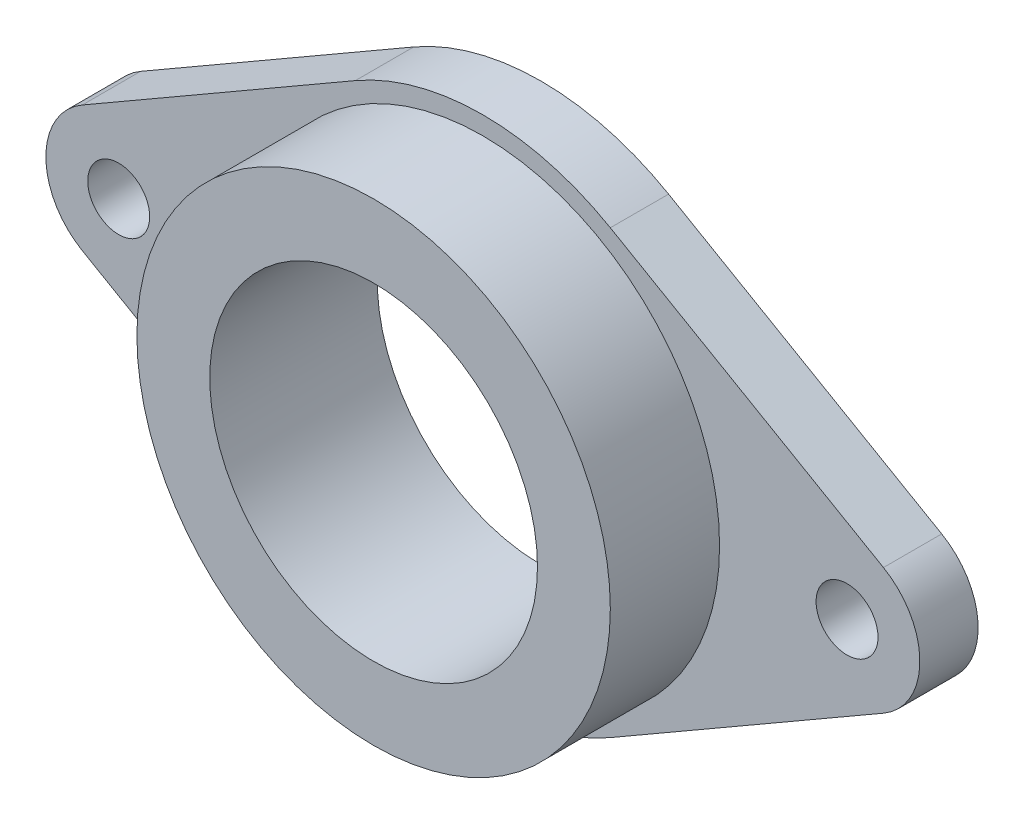
ISO-10303-21;
HEADER;
FILE_DESCRIPTION(('STEP AP214'),'2;1');
FILE_NAME('part.step','',(''),(''),'','','');
FILE_SCHEMA(('AUTOMOTIVE_DESIGN { 1 0 10303 214 1 1 1 1 }'));
ENDSEC;
DATA;
#1=APPLICATION_CONTEXT('core data for automotive mechanical design processes');
#2=APPLICATION_PROTOCOL_DEFINITION('international standard','automotive_design',2000,#1);
#3=PRODUCT_CONTEXT('',#1,'mechanical');
#4=PRODUCT('Part','Part','',(#3));
#5=PRODUCT_RELATED_PRODUCT_CATEGORY('part','',(#4));
#6=PRODUCT_DEFINITION_FORMATION('','',#4);
#7=PRODUCT_DEFINITION_CONTEXT('part definition',#1,'design');
#8=PRODUCT_DEFINITION('design','',#6,#7);
#9=PRODUCT_DEFINITION_SHAPE('','',#8);
#10=(LENGTH_UNIT() NAMED_UNIT(*) SI_UNIT(.MILLI.,.METRE.));
#11=(NAMED_UNIT(*) PLANE_ANGLE_UNIT() SI_UNIT($,.RADIAN.));
#12=(NAMED_UNIT(*) SI_UNIT($,.STERADIAN.) SOLID_ANGLE_UNIT());
#13=UNCERTAINTY_MEASURE_WITH_UNIT(LENGTH_MEASURE(1.E-05),#10,'distance_accuracy_value','');
#14=(GEOMETRIC_REPRESENTATION_CONTEXT(3) GLOBAL_UNCERTAINTY_ASSIGNED_CONTEXT((#13)) GLOBAL_UNIT_ASSIGNED_CONTEXT((#10,
#11,#12)) REPRESENTATION_CONTEXT('',''));
#15=CARTESIAN_POINT('',(0.,0.,0.));
#16=DIRECTION('',(0.,0.,1.));
#17=DIRECTION('',(1.,0.,0.));
#18=AXIS2_PLACEMENT_3D('',#15,#16,#17);
#19=CARTESIAN_POINT('',(-50.,0.,8.));
#20=DIRECTION('',(0.,0.,1.));
#21=DIRECTION('',(1.,0.,0.));
#22=AXIS2_PLACEMENT_3D('',#19,#20,#21);
#23=PLANE('',#22);
#24=CARTESIAN_POINT('',(0.,0.,8.));
#25=DIRECTION('',(0.,0.,1.));
#26=DIRECTION('',(1.,0.,0.));
#27=AXIS2_PLACEMENT_3D('',#24,#25,#26);
#28=CIRCLE('',#27,32.5);
#29=CARTESIAN_POINT('',(32.5,0.,8.));
#30=VERTEX_POINT('',#29);
#31=EDGE_CURVE('E231',#30,#30,#28,.T.);
#32=ORIENTED_EDGE('',*,*,#31,.F.);
#33=EDGE_LOOP('',(#32));
#34=FACE_BOUND('',#33,.T.);
#35=CARTESIAN_POINT('',(-50.,0.,8.));
#36=DIRECTION('',(0.,0.,1.));
#37=DIRECTION('',(1.,0.,0.));
#38=AXIS2_PLACEMENT_3D('',#35,#36,#37);
#39=CIRCLE('',#38,4.25000000000001);
#40=CARTESIAN_POINT('',(-45.75,0.,8.));
#41=VERTEX_POINT('',#40);
#42=EDGE_CURVE('E152',#41,#41,#39,.T.);
#43=ORIENTED_EDGE('',*,*,#42,.F.);
#44=EDGE_LOOP('',(#43));
#45=FACE_BOUND('',#44,.T.);
#46=CARTESIAN_POINT('',(-50.,0.,8.));
#47=DIRECTION('',(0.,0.,1.));
#48=DIRECTION('',(1.,0.,0.));
#49=AXIS2_PLACEMENT_3D('',#46,#47,#48);
#50=CIRCLE('',#49,10.);
#51=CARTESIAN_POINT('',(-55.,8.66025403784439,8.));
#52=VERTEX_POINT('',#51);
#53=CARTESIAN_POINT('',(-55.,-8.66025403784439,8.));
#54=VERTEX_POINT('',#53);
#55=EDGE_CURVE('E170',#52,#54,#50,.T.);
#56=ORIENTED_EDGE('',*,*,#55,.T.);
#57=DIRECTION('',(0.866025403784439,-0.5,0.));
#58=VECTOR('',#57,1.);
#59=CARTESIAN_POINT('',(-55.,-8.66025403784439,8.));
#60=LINE('',#59,#58);
#61=CARTESIAN_POINT('',(-17.5,-30.3108891324554,8.));
#62=VERTEX_POINT('',#61);
#63=EDGE_CURVE('E106',#54,#62,#60,.T.);
#64=ORIENTED_EDGE('',*,*,#63,.T.);
#65=CARTESIAN_POINT('',(0.,0.,8.));
#66=DIRECTION('',(0.,0.,1.));
#67=DIRECTION('',(1.,0.,0.));
#68=AXIS2_PLACEMENT_3D('',#65,#66,#67);
#69=CIRCLE('',#68,35.);
#70=CARTESIAN_POINT('',(17.5,-30.3108891324554,8.));
#71=VERTEX_POINT('',#70);
#72=EDGE_CURVE('E191',#62,#71,#69,.T.);
#73=ORIENTED_EDGE('',*,*,#72,.T.);
#74=DIRECTION('',(0.866025403784439,0.5,0.));
#75=VECTOR('',#74,1.);
#76=CARTESIAN_POINT('',(55.,-8.6602540378444,8.));
#77=LINE('',#76,#75);
#78=CARTESIAN_POINT('',(55.,-8.66025403784439,8.));
#79=VERTEX_POINT('',#78);
#80=EDGE_CURVE('E205',#71,#79,#77,.T.);
#81=ORIENTED_EDGE('',*,*,#80,.T.);
#82=CARTESIAN_POINT('',(50.,0.,8.));
#83=DIRECTION('',(0.,0.,1.));
#84=DIRECTION('',(1.,0.,0.));
#85=AXIS2_PLACEMENT_3D('',#82,#83,#84);
#86=CIRCLE('',#85,10.);
#87=CARTESIAN_POINT('',(55.,8.6602540378444,8.));
#88=VERTEX_POINT('',#87);
#89=EDGE_CURVE('E125',#79,#88,#86,.T.);
#90=ORIENTED_EDGE('',*,*,#89,.T.);
#91=DIRECTION('',(-0.866025403784439,0.5,0.));
#92=VECTOR('',#91,1.);
#93=CARTESIAN_POINT('',(55.,8.6602540378444,8.));
#94=LINE('',#93,#92);
#95=CARTESIAN_POINT('',(17.5,30.3108891324554,8.));
#96=VERTEX_POINT('',#95);
#97=EDGE_CURVE('E119',#88,#96,#94,.T.);
#98=ORIENTED_EDGE('',*,*,#97,.T.);
#99=CARTESIAN_POINT('',(0.,0.,8.));
#100=DIRECTION('',(0.,0.,1.));
#101=DIRECTION('',(1.,0.,0.));
#102=AXIS2_PLACEMENT_3D('',#99,#100,#101);
#103=CIRCLE('',#102,35.);
#104=CARTESIAN_POINT('',(-17.5,30.3108891324554,8.));
#105=VERTEX_POINT('',#104);
#106=EDGE_CURVE('E123',#96,#105,#103,.T.);
#107=ORIENTED_EDGE('',*,*,#106,.T.);
#108=DIRECTION('',(-0.866025403784439,-0.5,0.));
#109=VECTOR('',#108,1.);
#110=CARTESIAN_POINT('',(-55.,8.66025403784439,8.));
#111=LINE('',#110,#109);
#112=EDGE_CURVE('E63',#105,#52,#111,.T.);
#113=ORIENTED_EDGE('',*,*,#112,.T.);
#114=EDGE_LOOP('',(#56,#64,#73,#81,#90,#98,#107,#113));
#115=FACE_BOUND('',#114,.T.);
#116=CARTESIAN_POINT('',(50.,0.,8.));
#117=DIRECTION('',(0.,0.,1.));
#118=DIRECTION('',(1.,0.,0.));
#119=AXIS2_PLACEMENT_3D('',#116,#117,#118);
#120=CIRCLE('',#119,4.25000000000001);
#121=CARTESIAN_POINT('',(54.25,0.,8.));
#122=VERTEX_POINT('',#121);
#123=EDGE_CURVE('E219',#122,#122,#120,.T.);
#124=ORIENTED_EDGE('',*,*,#123,.F.);
#125=EDGE_LOOP('',(#124));
#126=FACE_BOUND('',#125,.T.);
#127=ADVANCED_FACE('F45',(#34,#45,#115,#126),#23,.T.);
#128=CARTESIAN_POINT('',(-50.,0.,0.));
#129=DIRECTION('',(0.,0.,1.));
#130=DIRECTION('',(1.,0.,0.));
#131=AXIS2_PLACEMENT_3D('',#128,#129,#130);
#132=PLANE('',#131);
#133=CARTESIAN_POINT('',(0.,0.,0.));
#134=DIRECTION('',(0.,0.,1.));
#135=DIRECTION('',(1.,0.,0.));
#136=AXIS2_PLACEMENT_3D('',#133,#134,#135);
#137=CIRCLE('',#136,22.5);
#138=CARTESIAN_POINT('',(22.5,0.,0.));
#139=VERTEX_POINT('',#138);
#140=EDGE_CURVE('E235',#139,#139,#137,.T.);
#141=ORIENTED_EDGE('',*,*,#140,.T.);
#142=EDGE_LOOP('',(#141));
#143=FACE_BOUND('',#142,.T.);
#144=CARTESIAN_POINT('',(-50.,0.,0.));
#145=DIRECTION('',(0.,0.,1.));
#146=DIRECTION('',(1.,0.,0.));
#147=AXIS2_PLACEMENT_3D('',#144,#145,#146);
#148=CIRCLE('',#147,10.);
#149=CARTESIAN_POINT('',(-55.,8.66025403784439,0.));
#150=VERTEX_POINT('',#149);
#151=CARTESIAN_POINT('',(-55.,-8.66025403784439,0.));
#152=VERTEX_POINT('',#151);
#153=EDGE_CURVE('E147',#150,#152,#148,.T.);
#154=ORIENTED_EDGE('',*,*,#153,.F.);
#155=DIRECTION('',(-0.866025403784439,-0.5,0.));
#156=VECTOR('',#155,1.);
#157=CARTESIAN_POINT('',(-55.,8.66025403784439,0.));
#158=LINE('',#157,#156);
#159=CARTESIAN_POINT('',(-17.5,30.3108891324554,0.));
#160=VERTEX_POINT('',#159);
#161=EDGE_CURVE('E98',#160,#150,#158,.T.);
#162=ORIENTED_EDGE('',*,*,#161,.F.);
#163=CARTESIAN_POINT('',(0.,0.,0.));
#164=DIRECTION('',(0.,0.,1.));
#165=DIRECTION('',(1.,0.,0.));
#166=AXIS2_PLACEMENT_3D('',#163,#164,#165);
#167=CIRCLE('',#166,35.);
#168=CARTESIAN_POINT('',(17.5,30.3108891324554,0.));
#169=VERTEX_POINT('',#168);
#170=EDGE_CURVE('E92',#169,#160,#167,.T.);
#171=ORIENTED_EDGE('',*,*,#170,.F.);
#172=DIRECTION('',(-0.866025403784439,0.5,0.));
#173=VECTOR('',#172,1.);
#174=CARTESIAN_POINT('',(55.,8.6602540378444,0.));
#175=LINE('',#174,#173);
#176=CARTESIAN_POINT('',(55.,8.6602540378444,0.));
#177=VERTEX_POINT('',#176);
#178=EDGE_CURVE('E134',#177,#169,#175,.T.);
#179=ORIENTED_EDGE('',*,*,#178,.F.);
#180=CARTESIAN_POINT('',(50.,0.,0.));
#181=DIRECTION('',(0.,0.,1.));
#182=DIRECTION('',(1.,0.,0.));
#183=AXIS2_PLACEMENT_3D('',#180,#181,#182);
#184=CIRCLE('',#183,10.);
#185=CARTESIAN_POINT('',(55.,-8.66025403784439,0.));
#186=VERTEX_POINT('',#185);
#187=EDGE_CURVE('E161',#186,#177,#184,.T.);
#188=ORIENTED_EDGE('',*,*,#187,.F.);
#189=DIRECTION('',(0.866025403784439,0.5,0.));
#190=VECTOR('',#189,1.);
#191=CARTESIAN_POINT('',(55.,-8.6602540378444,0.));
#192=LINE('',#191,#190);
#193=CARTESIAN_POINT('',(17.5,-30.3108891324554,0.));
#194=VERTEX_POINT('',#193);
#195=EDGE_CURVE('E158',#194,#186,#192,.T.);
#196=ORIENTED_EDGE('',*,*,#195,.F.);
#197=CARTESIAN_POINT('',(0.,0.,0.));
#198=DIRECTION('',(0.,0.,1.));
#199=DIRECTION('',(1.,0.,0.));
#200=AXIS2_PLACEMENT_3D('',#197,#198,#199);
#201=CIRCLE('',#200,35.);
#202=CARTESIAN_POINT('',(-17.5,-30.3108891324554,0.));
#203=VERTEX_POINT('',#202);
#204=EDGE_CURVE('E155',#203,#194,#201,.T.);
#205=ORIENTED_EDGE('',*,*,#204,.F.);
#206=DIRECTION('',(0.866025403784439,-0.5,0.));
#207=VECTOR('',#206,1.);
#208=CARTESIAN_POINT('',(-55.,-8.66025403784439,0.));
#209=LINE('',#208,#207);
#210=EDGE_CURVE('E151',#152,#203,#209,.T.);
#211=ORIENTED_EDGE('',*,*,#210,.F.);
#212=EDGE_LOOP('',(#154,#162,#171,#179,#188,#196,#205,#211));
#213=FACE_BOUND('',#212,.T.);
#214=CARTESIAN_POINT('',(-50.,0.,0.));
#215=DIRECTION('',(0.,0.,1.));
#216=DIRECTION('',(1.,0.,0.));
#217=AXIS2_PLACEMENT_3D('',#214,#215,#216);
#218=CIRCLE('',#217,4.25000000000001);
#219=CARTESIAN_POINT('',(-45.75,0.,0.));
#220=VERTEX_POINT('',#219);
#221=EDGE_CURVE('E215',#220,#220,#218,.T.);
#222=ORIENTED_EDGE('',*,*,#221,.T.);
#223=EDGE_LOOP('',(#222));
#224=FACE_BOUND('',#223,.T.);
#225=CARTESIAN_POINT('',(50.,0.,0.));
#226=DIRECTION('',(0.,0.,1.));
#227=DIRECTION('',(1.,0.,0.));
#228=AXIS2_PLACEMENT_3D('',#225,#226,#227);
#229=CIRCLE('',#228,4.25000000000001);
#230=CARTESIAN_POINT('',(54.25,0.,0.));
#231=VERTEX_POINT('',#230);
#232=EDGE_CURVE('E223',#231,#231,#229,.T.);
#233=ORIENTED_EDGE('',*,*,#232,.T.);
#234=EDGE_LOOP('',(#233));
#235=FACE_BOUND('',#234,.T.);
#236=ADVANCED_FACE('F195',(#143,#213,#224,#235),#132,.F.);
#237=CARTESIAN_POINT('',(-50.,0.,8.));
#238=DIRECTION('',(0.,0.,-1.));
#239=DIRECTION('',(-1.,0.,0.));
#240=AXIS2_PLACEMENT_3D('',#237,#238,#239);
#241=CYLINDRICAL_SURFACE('',#240,10.);
#242=ORIENTED_EDGE('',*,*,#153,.T.);
#243=DIRECTION('',(0.,0.,-1.));
#244=VECTOR('',#243,1.);
#245=CARTESIAN_POINT('',(-55.,-8.66025403784439,8.));
#246=LINE('',#245,#244);
#247=EDGE_CURVE('E11',#54,#152,#246,.T.);
#248=ORIENTED_EDGE('',*,*,#247,.F.);
#249=ORIENTED_EDGE('',*,*,#55,.F.);
#250=DIRECTION('',(0.,0.,-1.));
#251=VECTOR('',#250,1.);
#252=CARTESIAN_POINT('',(-55.,8.66025403784439,8.));
#253=LINE('',#252,#251);
#254=EDGE_CURVE('E143',#52,#150,#253,.T.);
#255=ORIENTED_EDGE('',*,*,#254,.T.);
#256=EDGE_LOOP('',(#242,#248,#249,#255));
#257=FACE_BOUND('',#256,.T.);
#258=ADVANCED_FACE('F47',(#257),#241,.T.);
#259=CARTESIAN_POINT('',(-55.,-8.66025403784439,8.));
#260=DIRECTION('',(0.5,0.866025403784439,0.));
#261=DIRECTION('',(-0.866025403784439,0.5,0.));
#262=AXIS2_PLACEMENT_3D('',#259,#260,#261);
#263=PLANE('',#262);
#264=ORIENTED_EDGE('',*,*,#210,.T.);
#265=DIRECTION('',(0.,0.,-1.));
#266=VECTOR('',#265,1.);
#267=CARTESIAN_POINT('',(-17.5,-30.3108891324554,8.));
#268=LINE('',#267,#266);
#269=EDGE_CURVE('E55',#62,#203,#268,.T.);
#270=ORIENTED_EDGE('',*,*,#269,.F.);
#271=ORIENTED_EDGE('',*,*,#63,.F.);
#272=ORIENTED_EDGE('',*,*,#247,.T.);
#273=EDGE_LOOP('',(#264,#270,#271,#272));
#274=FACE_BOUND('',#273,.T.);
#275=ADVANCED_FACE('F300',(#274),#263,.F.);
#276=CARTESIAN_POINT('',(0.,0.,8.));
#277=DIRECTION('',(0.,0.,-1.));
#278=DIRECTION('',(-1.,0.,0.));
#279=AXIS2_PLACEMENT_3D('',#276,#277,#278);
#280=CYLINDRICAL_SURFACE('',#279,35.);
#281=ORIENTED_EDGE('',*,*,#204,.T.);
#282=DIRECTION('',(0.,0.,-1.));
#283=VECTOR('',#282,1.);
#284=CARTESIAN_POINT('',(17.5,-30.3108891324554,8.));
#285=LINE('',#284,#283);
#286=EDGE_CURVE('E181',#71,#194,#285,.T.);
#287=ORIENTED_EDGE('',*,*,#286,.F.);
#288=ORIENTED_EDGE('',*,*,#72,.F.);
#289=ORIENTED_EDGE('',*,*,#269,.T.);
#290=EDGE_LOOP('',(#281,#287,#288,#289));
#291=FACE_BOUND('',#290,.T.);
#292=ADVANCED_FACE('F189',(#291),#280,.T.);
#293=CARTESIAN_POINT('',(55.,-8.6602540378444,8.));
#294=DIRECTION('',(-0.5,0.866025403784439,0.));
#295=DIRECTION('',(-0.866025403784439,-0.5,0.));
#296=AXIS2_PLACEMENT_3D('',#293,#294,#295);
#297=PLANE('',#296);
#298=ORIENTED_EDGE('',*,*,#195,.T.);
#299=DIRECTION('',(0.,0.,-1.));
#300=VECTOR('',#299,1.);
#301=CARTESIAN_POINT('',(55.,-8.66025403784439,8.));
#302=LINE('',#301,#300);
#303=EDGE_CURVE('E177',#79,#186,#302,.T.);
#304=ORIENTED_EDGE('',*,*,#303,.F.);
#305=ORIENTED_EDGE('',*,*,#80,.F.);
#306=ORIENTED_EDGE('',*,*,#286,.T.);
#307=EDGE_LOOP('',(#298,#304,#305,#306));
#308=FACE_BOUND('',#307,.T.);
#309=ADVANCED_FACE('F200',(#308),#297,.F.);
#310=CARTESIAN_POINT('',(50.,0.,8.));
#311=DIRECTION('',(0.,0.,-1.));
#312=DIRECTION('',(-1.,0.,0.));
#313=AXIS2_PLACEMENT_3D('',#310,#311,#312);
#314=CYLINDRICAL_SURFACE('',#313,10.);
#315=ORIENTED_EDGE('',*,*,#187,.T.);
#316=DIRECTION('',(0.,0.,-1.));
#317=VECTOR('',#316,1.);
#318=CARTESIAN_POINT('',(55.,8.6602540378444,8.));
#319=LINE('',#318,#317);
#320=EDGE_CURVE('E136',#88,#177,#319,.T.);
#321=ORIENTED_EDGE('',*,*,#320,.F.);
#322=ORIENTED_EDGE('',*,*,#89,.F.);
#323=ORIENTED_EDGE('',*,*,#303,.T.);
#324=EDGE_LOOP('',(#315,#321,#322,#323));
#325=FACE_BOUND('',#324,.T.);
#326=ADVANCED_FACE('F203',(#325),#314,.T.);
#327=CARTESIAN_POINT('',(55.,8.6602540378444,8.));
#328=DIRECTION('',(-0.5,-0.866025403784439,0.));
#329=DIRECTION('',(0.866025403784439,-0.5,0.));
#330=AXIS2_PLACEMENT_3D('',#327,#328,#329);
#331=PLANE('',#330);
#332=ORIENTED_EDGE('',*,*,#178,.T.);
#333=DIRECTION('',(0.,0.,-1.));
#334=VECTOR('',#333,1.);
#335=CARTESIAN_POINT('',(17.5,30.3108891324554,8.));
#336=LINE('',#335,#334);
#337=EDGE_CURVE('E131',#96,#169,#336,.T.);
#338=ORIENTED_EDGE('',*,*,#337,.F.);
#339=ORIENTED_EDGE('',*,*,#97,.F.);
#340=ORIENTED_EDGE('',*,*,#320,.T.);
#341=EDGE_LOOP('',(#332,#338,#339,#340));
#342=FACE_BOUND('',#341,.T.);
#343=ADVANCED_FACE('F132',(#342),#331,.F.);
#344=CARTESIAN_POINT('',(0.,0.,8.));
#345=DIRECTION('',(0.,0.,-1.));
#346=DIRECTION('',(-1.,0.,0.));
#347=AXIS2_PLACEMENT_3D('',#344,#345,#346);
#348=CYLINDRICAL_SURFACE('',#347,35.);
#349=ORIENTED_EDGE('',*,*,#170,.T.);
#350=DIRECTION('',(0.,0.,-1.));
#351=VECTOR('',#350,1.);
#352=CARTESIAN_POINT('',(-17.5,30.3108891324554,8.));
#353=LINE('',#352,#351);
#354=EDGE_CURVE('E137',#105,#160,#353,.T.);
#355=ORIENTED_EDGE('',*,*,#354,.F.);
#356=ORIENTED_EDGE('',*,*,#106,.F.);
#357=ORIENTED_EDGE('',*,*,#337,.T.);
#358=EDGE_LOOP('',(#349,#355,#356,#357));
#359=FACE_BOUND('',#358,.T.);
#360=ADVANCED_FACE('F139',(#359),#348,.T.);
#361=CARTESIAN_POINT('',(-55.,8.66025403784439,8.));
#362=DIRECTION('',(0.5,-0.866025403784439,0.));
#363=DIRECTION('',(0.866025403784439,0.5,0.));
#364=AXIS2_PLACEMENT_3D('',#361,#362,#363);
#365=PLANE('',#364);
#366=ORIENTED_EDGE('',*,*,#161,.T.);
#367=ORIENTED_EDGE('',*,*,#254,.F.);
#368=ORIENTED_EDGE('',*,*,#112,.F.);
#369=ORIENTED_EDGE('',*,*,#354,.T.);
#370=EDGE_LOOP('',(#366,#367,#368,#369));
#371=FACE_BOUND('',#370,.T.);
#372=ADVANCED_FACE('F275',(#371),#365,.F.);
#373=CARTESIAN_POINT('',(-50.,0.,8.));
#374=DIRECTION('',(0.,0.,-1.));
#375=DIRECTION('',(-1.,0.,0.));
#376=AXIS2_PLACEMENT_3D('',#373,#374,#375);
#377=CYLINDRICAL_SURFACE('',#376,4.25000000000001);
#378=ORIENTED_EDGE('',*,*,#42,.T.);
#379=EDGE_LOOP('',(#378));
#380=FACE_BOUND('',#379,.T.);
#381=ORIENTED_EDGE('',*,*,#221,.F.);
#382=EDGE_LOOP('',(#381));
#383=FACE_BOUND('',#382,.T.);
#384=ADVANCED_FACE('F272',(#380,#383),#377,.F.);
#385=CARTESIAN_POINT('',(50.,0.,8.));
#386=DIRECTION('',(0.,0.,-1.));
#387=DIRECTION('',(-1.,0.,0.));
#388=AXIS2_PLACEMENT_3D('',#385,#386,#387);
#389=CYLINDRICAL_SURFACE('',#388,4.25000000000001);
#390=ORIENTED_EDGE('',*,*,#123,.T.);
#391=EDGE_LOOP('',(#390));
#392=FACE_BOUND('',#391,.T.);
#393=ORIENTED_EDGE('',*,*,#232,.F.);
#394=EDGE_LOOP('',(#393));
#395=FACE_BOUND('',#394,.T.);
#396=ADVANCED_FACE('F263',(#392,#395),#389,.F.);
#397=CARTESIAN_POINT('',(0.,0.,23.));
#398=DIRECTION('',(0.,0.,-1.));
#399=DIRECTION('',(-1.,0.,0.));
#400=AXIS2_PLACEMENT_3D('',#397,#398,#399);
#401=CYLINDRICAL_SURFACE('',#400,32.5);
#402=CARTESIAN_POINT('',(0.,0.,23.));
#403=DIRECTION('',(0.,0.,1.));
#404=DIRECTION('',(1.,0.,0.));
#405=AXIS2_PLACEMENT_3D('',#402,#403,#404);
#406=CIRCLE('',#405,32.5);
#407=CARTESIAN_POINT('',(32.5,0.,23.));
#408=VERTEX_POINT('',#407);
#409=EDGE_CURVE('E227',#408,#408,#406,.T.);
#410=ORIENTED_EDGE('',*,*,#409,.F.);
#411=EDGE_LOOP('',(#410));
#412=FACE_BOUND('',#411,.T.);
#413=ORIENTED_EDGE('',*,*,#31,.T.);
#414=EDGE_LOOP('',(#413));
#415=FACE_BOUND('',#414,.T.);
#416=ADVANCED_FACE('F257',(#412,#415),#401,.T.);
#417=CARTESIAN_POINT('',(0.,0.,23.));
#418=DIRECTION('',(0.,0.,1.));
#419=DIRECTION('',(1.,0.,0.));
#420=AXIS2_PLACEMENT_3D('',#417,#418,#419);
#421=PLANE('',#420);
#422=CARTESIAN_POINT('',(0.,0.,23.));
#423=DIRECTION('',(0.,0.,1.));
#424=DIRECTION('',(1.,0.,0.));
#425=AXIS2_PLACEMENT_3D('',#422,#423,#424);
#426=CIRCLE('',#425,22.5);
#427=CARTESIAN_POINT('',(22.5,0.,23.));
#428=VERTEX_POINT('',#427);
#429=EDGE_CURVE('E239',#428,#428,#426,.T.);
#430=ORIENTED_EDGE('',*,*,#429,.F.);
#431=EDGE_LOOP('',(#430));
#432=FACE_BOUND('',#431,.T.);
#433=ORIENTED_EDGE('',*,*,#409,.T.);
#434=EDGE_LOOP('',(#433));
#435=FACE_BOUND('',#434,.T.);
#436=ADVANCED_FACE('F251',(#432,#435),#421,.T.);
#437=CARTESIAN_POINT('',(0.,0.,0.));
#438=DIRECTION('',(0.,0.,1.));
#439=DIRECTION('',(1.,0.,0.));
#440=AXIS2_PLACEMENT_3D('',#437,#438,#439);
#441=CYLINDRICAL_SURFACE('',#440,22.5);
#442=ORIENTED_EDGE('',*,*,#140,.F.);
#443=EDGE_LOOP('',(#442));
#444=FACE_BOUND('',#443,.T.);
#445=ORIENTED_EDGE('',*,*,#429,.T.);
#446=EDGE_LOOP('',(#445));
#447=FACE_BOUND('',#446,.T.);
#448=ADVANCED_FACE('F248',(#444,#447),#441,.F.);
#449=CLOSED_SHELL('',(#127,#236,#258,#275,#292,#309,#326,#343,#360,#372,#384,#396,#416,#436,#448));
#450=MANIFOLD_SOLID_BREP('B2',#449);
#451=ADVANCED_BREP_SHAPE_REPRESENTATION('',(#18,#450),#14);
#452=SHAPE_DEFINITION_REPRESENTATION(#9,#451);
ENDSEC;
END-ISO-10303-21;
